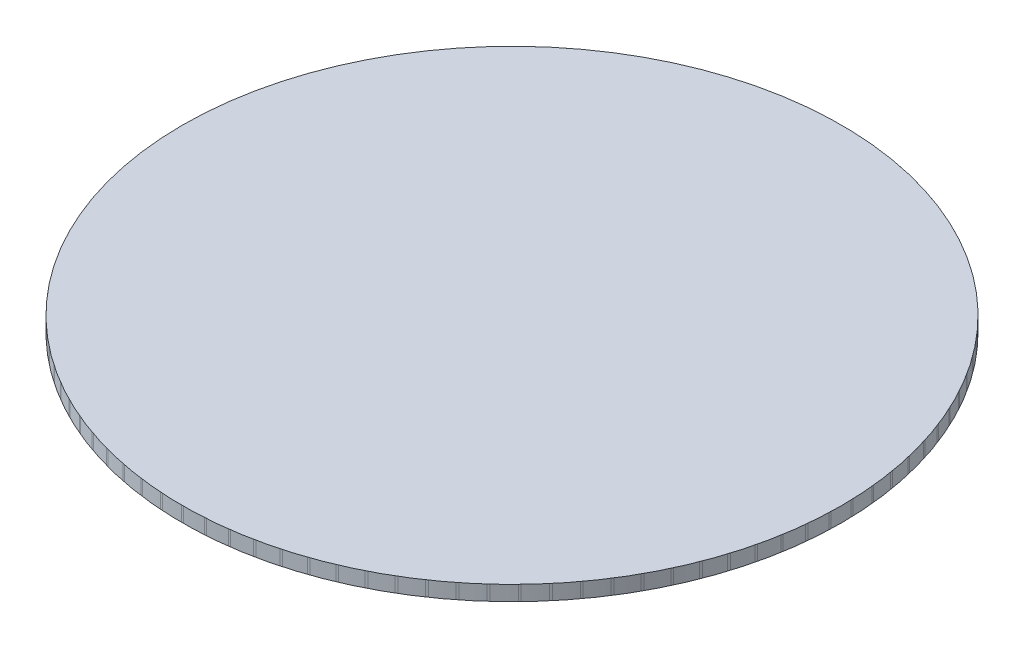
ISO-10303-21;
HEADER;
FILE_DESCRIPTION(('STEP AP214'),'2;1');
FILE_NAME('part.step','',(''),(''),'','','');
FILE_SCHEMA(('AUTOMOTIVE_DESIGN { 1 0 10303 214 1 1 1 1 }'));
ENDSEC;
DATA;
#1=APPLICATION_CONTEXT('core data for automotive mechanical design processes');
#2=APPLICATION_PROTOCOL_DEFINITION('international standard','automotive_design',2000,#1);
#3=PRODUCT_CONTEXT('',#1,'mechanical');
#4=PRODUCT('Part','Part','',(#3));
#5=PRODUCT_RELATED_PRODUCT_CATEGORY('part','',(#4));
#6=PRODUCT_DEFINITION_FORMATION('','',#4);
#7=PRODUCT_DEFINITION_CONTEXT('part definition',#1,'design');
#8=PRODUCT_DEFINITION('design','',#6,#7);
#9=PRODUCT_DEFINITION_SHAPE('','',#8);
#10=(LENGTH_UNIT() NAMED_UNIT(*) SI_UNIT(.MILLI.,.METRE.));
#11=(NAMED_UNIT(*) PLANE_ANGLE_UNIT() SI_UNIT($,.RADIAN.));
#12=(NAMED_UNIT(*) SI_UNIT($,.STERADIAN.) SOLID_ANGLE_UNIT());
#13=UNCERTAINTY_MEASURE_WITH_UNIT(LENGTH_MEASURE(1.E-05),#10,'distance_accuracy_value','');
#14=(GEOMETRIC_REPRESENTATION_CONTEXT(3) GLOBAL_UNCERTAINTY_ASSIGNED_CONTEXT((#13)) GLOBAL_UNIT_ASSIGNED_CONTEXT((#10,
#11,#12)) REPRESENTATION_CONTEXT('',''));
#15=CARTESIAN_POINT('',(0.,0.,0.));
#16=DIRECTION('',(0.,0.,1.));
#17=DIRECTION('',(1.,0.,0.));
#18=AXIS2_PLACEMENT_3D('',#15,#16,#17);
#19=CARTESIAN_POINT('',(0.,200.,0.));
#20=DIRECTION('',(0.,1.,0.));
#21=DIRECTION('',(0.,0.,1.));
#22=AXIS2_PLACEMENT_3D('',#19,#20,#21);
#23=PLANE('',#22);
#24=CARTESIAN_POINT('',(0.,200.,0.));
#25=DIRECTION('',(0.,1.,0.));
#26=DIRECTION('',(1.,0.,0.));
#27=AXIS2_PLACEMENT_3D('',#24,#25,#26);
#28=CIRCLE('',#27,4402.);
#29=CARTESIAN_POINT('',(4402.,200.,0.));
#30=VERTEX_POINT('',#29);
#31=EDGE_CURVE('E11',#30,#30,#28,.T.);
#32=ORIENTED_EDGE('',*,*,#31,.T.);
#33=EDGE_LOOP('',(#32));
#34=FACE_BOUND('',#33,.T.);
#35=CARTESIAN_POINT('',(0.,200.,0.));
#36=DIRECTION('',(0.,1.,0.));
#37=DIRECTION('',(0.,0.,1.));
#38=AXIS2_PLACEMENT_3D('',#35,#36,#37);
#39=CIRCLE('',#38,4400.);
#40=CARTESIAN_POINT('',(0.,200.,4400.));
#41=VERTEX_POINT('',#40);
#42=EDGE_CURVE('E52',#41,#41,#39,.T.);
#43=ORIENTED_EDGE('',*,*,#42,.F.);
#44=EDGE_LOOP('',(#43));
#45=FACE_BOUND('',#44,.T.);
#46=ADVANCED_FACE('F41',(#34,#45),#23,.T.);
#47=CARTESIAN_POINT('',(0.,0.,0.));
#48=DIRECTION('',(0.,1.,0.));
#49=DIRECTION('',(0.,0.,1.));
#50=AXIS2_PLACEMENT_3D('',#47,#48,#49);
#51=PLANE('',#50);
#52=CARTESIAN_POINT('',(0.,0.,0.));
#53=DIRECTION('',(0.,1.,0.));
#54=DIRECTION('',(1.,0.,0.));
#55=AXIS2_PLACEMENT_3D('',#52,#53,#54);
#56=CIRCLE('',#55,4402.);
#57=CARTESIAN_POINT('',(4402.,0.,0.));
#58=VERTEX_POINT('',#57);
#59=EDGE_CURVE('E45',#58,#58,#56,.T.);
#60=ORIENTED_EDGE('',*,*,#59,.F.);
#61=EDGE_LOOP('',(#60));
#62=FACE_BOUND('',#61,.T.);
#63=CARTESIAN_POINT('',(0.,0.,0.));
#64=DIRECTION('',(0.,1.,0.));
#65=DIRECTION('',(0.,0.,1.));
#66=AXIS2_PLACEMENT_3D('',#63,#64,#65);
#67=CIRCLE('',#66,4400.);
#68=CARTESIAN_POINT('',(0.,0.,4400.));
#69=VERTEX_POINT('',#68);
#70=EDGE_CURVE('E54',#69,#69,#67,.T.);
#71=ORIENTED_EDGE('',*,*,#70,.T.);
#72=EDGE_LOOP('',(#71));
#73=FACE_BOUND('',#72,.T.);
#74=ADVANCED_FACE('F64',(#62,#73),#51,.F.);
#75=CARTESIAN_POINT('',(0.,200.,0.));
#76=DIRECTION('',(0.,-1.,0.));
#77=DIRECTION('',(0.,0.,-1.));
#78=AXIS2_PLACEMENT_3D('',#75,#76,#77);
#79=CYLINDRICAL_SURFACE('',#78,4402.);
#80=ORIENTED_EDGE('',*,*,#31,.F.);
#81=EDGE_LOOP('',(#80));
#82=FACE_BOUND('',#81,.T.);
#83=ORIENTED_EDGE('',*,*,#59,.T.);
#84=EDGE_LOOP('',(#83));
#85=FACE_BOUND('',#84,.T.);
#86=ADVANCED_FACE('F43',(#82,#85),#79,.T.);
#87=CARTESIAN_POINT('',(0.,200.,0.));
#88=DIRECTION('',(0.,-1.,0.));
#89=DIRECTION('',(0.,0.,-1.));
#90=AXIS2_PLACEMENT_3D('',#87,#88,#89);
#91=CYLINDRICAL_SURFACE('',#90,4400.);
#92=ORIENTED_EDGE('',*,*,#42,.T.);
#93=EDGE_LOOP('',(#92));
#94=FACE_BOUND('',#93,.T.);
#95=ORIENTED_EDGE('',*,*,#70,.F.);
#96=EDGE_LOOP('',(#95));
#97=FACE_BOUND('',#96,.T.);
#98=ADVANCED_FACE('F60',(#94,#97),#91,.F.);
#99=CLOSED_SHELL('',(#46,#74,#86,#98));
#100=MANIFOLD_SOLID_BREP('B2',#99);
#101=ADVANCED_BREP_SHAPE_REPRESENTATION('',(#18,#100),#14);
#102=SHAPE_DEFINITION_REPRESENTATION(#9,#101);
ENDSEC;
END-ISO-10303-21;
